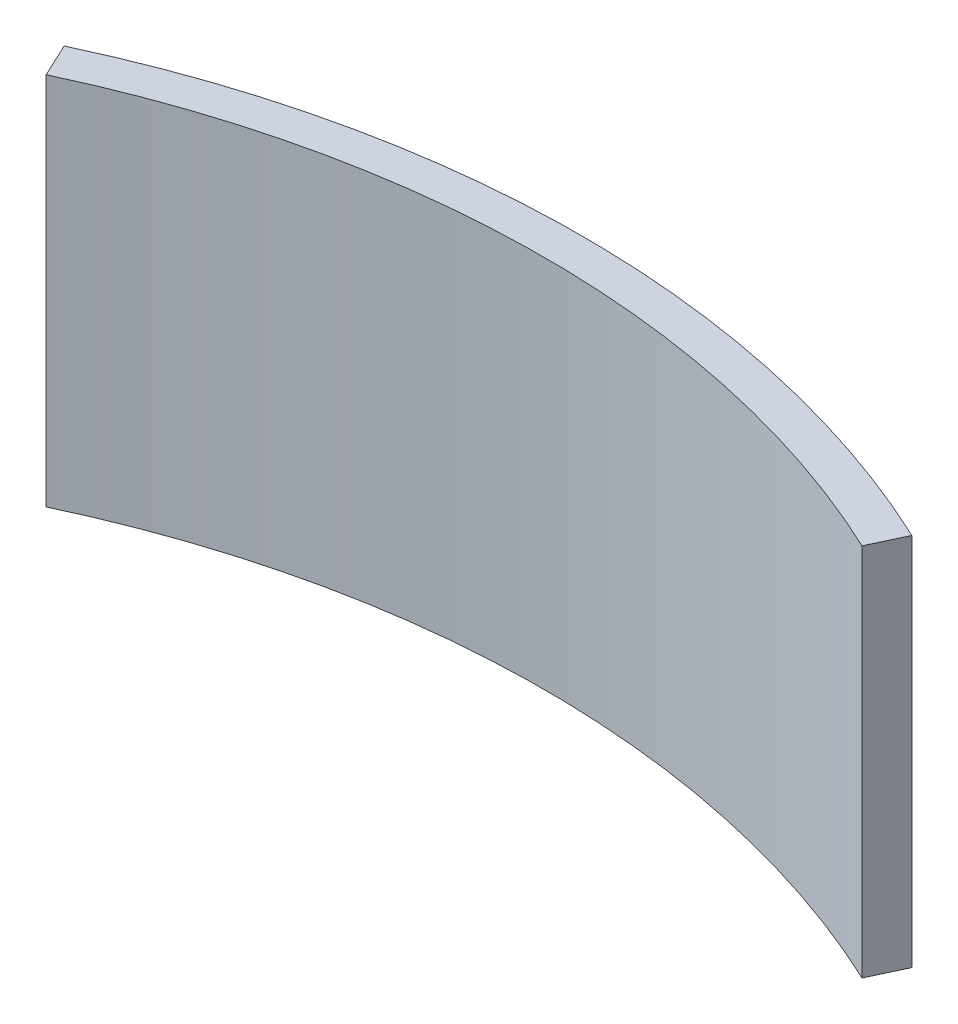
ISO-10303-21;
HEADER;
FILE_DESCRIPTION(('STEP AP214'),'2;1');
FILE_NAME('part.step','',(''),(''),'','','');
FILE_SCHEMA(('AUTOMOTIVE_DESIGN { 1 0 10303 214 1 1 1 1 }'));
ENDSEC;
DATA;
#1=APPLICATION_CONTEXT('core data for automotive mechanical design processes');
#2=APPLICATION_PROTOCOL_DEFINITION('international standard','automotive_design',2000,#1);
#3=PRODUCT_CONTEXT('',#1,'mechanical');
#4=PRODUCT('Part','Part','',(#3));
#5=PRODUCT_RELATED_PRODUCT_CATEGORY('part','',(#4));
#6=PRODUCT_DEFINITION_FORMATION('','',#4);
#7=PRODUCT_DEFINITION_CONTEXT('part definition',#1,'design');
#8=PRODUCT_DEFINITION('design','',#6,#7);
#9=PRODUCT_DEFINITION_SHAPE('','',#8);
#10=(LENGTH_UNIT() NAMED_UNIT(*) SI_UNIT(.MILLI.,.METRE.));
#11=(NAMED_UNIT(*) PLANE_ANGLE_UNIT() SI_UNIT($,.RADIAN.));
#12=(NAMED_UNIT(*) SI_UNIT($,.STERADIAN.) SOLID_ANGLE_UNIT());
#13=UNCERTAINTY_MEASURE_WITH_UNIT(LENGTH_MEASURE(1.E-05),#10,'distance_accuracy_value','');
#14=(GEOMETRIC_REPRESENTATION_CONTEXT(3) GLOBAL_UNCERTAINTY_ASSIGNED_CONTEXT((#13)) GLOBAL_UNIT_ASSIGNED_CONTEXT((#10,
#11,#12)) REPRESENTATION_CONTEXT('',''));
#15=CARTESIAN_POINT('',(0.,0.,0.));
#16=DIRECTION('',(0.,0.,1.));
#17=DIRECTION('',(1.,0.,0.));
#18=AXIS2_PLACEMENT_3D('',#15,#16,#17);
#19=CARTESIAN_POINT('',(0.,30.,0.));
#20=DIRECTION('',(0.,-1.,0.));
#21=DIRECTION('',(0.,0.,-1.));
#22=AXIS2_PLACEMENT_3D('',#19,#20,#21);
#23=CYLINDRICAL_SURFACE('',#22,80.);
#24=CARTESIAN_POINT('',(0.,0.,0.));
#25=DIRECTION('',(0.,1.,0.));
#26=DIRECTION('',(0.,0.,1.));
#27=AXIS2_PLACEMENT_3D('',#24,#25,#26);
#28=CIRCLE('',#27,80.);
#29=CARTESIAN_POINT('',(33.9742323512018,0.,-72.427560611597));
#30=VERTEX_POINT('',#29);
#31=CARTESIAN_POINT('',(-33.9742323512018,0.,-72.427560611597));
#32=VERTEX_POINT('',#31);
#33=EDGE_CURVE('E96',#30,#32,#28,.T.);
#34=ORIENTED_EDGE('',*,*,#33,.T.);
#35=DIRECTION('',(0.,-1.,0.));
#36=VECTOR('',#35,1.);
#37=CARTESIAN_POINT('',(-33.9742323512018,30.,-72.427560611597));
#38=LINE('',#37,#36);
#39=CARTESIAN_POINT('',(-33.9742323512018,30.,-72.427560611597));
#40=VERTEX_POINT('',#39);
#41=EDGE_CURVE('E11',#40,#32,#38,.T.);
#42=ORIENTED_EDGE('',*,*,#41,.F.);
#43=CARTESIAN_POINT('',(0.,30.,0.));
#44=DIRECTION('',(0.,1.,0.));
#45=DIRECTION('',(0.,0.,1.));
#46=AXIS2_PLACEMENT_3D('',#43,#44,#45);
#47=CIRCLE('',#46,80.);
#48=CARTESIAN_POINT('',(33.9742323512018,30.,-72.427560611597));
#49=VERTEX_POINT('',#48);
#50=EDGE_CURVE('E84',#49,#40,#47,.T.);
#51=ORIENTED_EDGE('',*,*,#50,.F.);
#52=DIRECTION('',(0.,-1.,0.));
#53=VECTOR('',#52,1.);
#54=CARTESIAN_POINT('',(33.9742323512018,30.,-72.427560611597));
#55=LINE('',#54,#53);
#56=EDGE_CURVE('E92',#49,#30,#55,.T.);
#57=ORIENTED_EDGE('',*,*,#56,.T.);
#58=EDGE_LOOP('',(#34,#42,#51,#57));
#59=FACE_BOUND('',#58,.T.);
#60=ADVANCED_FACE('F33',(#59),#23,.T.);
#61=CARTESIAN_POINT('',(-33.9742323512018,30.,-72.427560611597));
#62=DIRECTION('',(0.905344507644962,0.,-0.424677904390022));
#63=DIRECTION('',(-0.424677904390022,0.,-0.905344507644962));
#64=AXIS2_PLACEMENT_3D('',#61,#62,#63);
#65=PLANE('',#64);
#66=DIRECTION('',(0.424677904390022,0.,0.905344507644962));
#67=VECTOR('',#66,1.);
#68=CARTESIAN_POINT('',(-33.9742323512018,0.,-72.427560611597));
#69=LINE('',#68,#67);
#70=CARTESIAN_POINT('',(-32.7001986380317,0.,-69.7115270886621));
#71=VERTEX_POINT('',#70);
#72=EDGE_CURVE('E88',#32,#71,#69,.T.);
#73=ORIENTED_EDGE('',*,*,#72,.T.);
#74=DIRECTION('',(0.,-1.,0.));
#75=VECTOR('',#74,1.);
#76=CARTESIAN_POINT('',(-32.7001986380317,30.,-69.7115270886621));
#77=LINE('',#76,#75);
#78=CARTESIAN_POINT('',(-32.7001986380317,30.,-69.7115270886621));
#79=VERTEX_POINT('',#78);
#80=EDGE_CURVE('E41',#79,#71,#77,.T.);
#81=ORIENTED_EDGE('',*,*,#80,.F.);
#82=DIRECTION('',(0.424677904390022,0.,0.905344507644962));
#83=VECTOR('',#82,1.);
#84=CARTESIAN_POINT('',(-33.9742323512018,30.,-72.427560611597));
#85=LINE('',#84,#83);
#86=EDGE_CURVE('E79',#40,#79,#85,.T.);
#87=ORIENTED_EDGE('',*,*,#86,.F.);
#88=ORIENTED_EDGE('',*,*,#41,.T.);
#89=EDGE_LOOP('',(#73,#81,#87,#88));
#90=FACE_BOUND('',#89,.T.);
#91=ADVANCED_FACE('F87',(#90),#65,.F.);
#92=CARTESIAN_POINT('',(0.,30.,0.));
#93=DIRECTION('',(0.,-1.,0.));
#94=DIRECTION('',(0.,0.,-1.));
#95=AXIS2_PLACEMENT_3D('',#92,#93,#94);
#96=CYLINDRICAL_SURFACE('',#95,77.);
#97=CARTESIAN_POINT('',(0.,0.,0.));
#98=DIRECTION('',(0.,-1.,0.));
#99=DIRECTION('',(0.,0.,1.));
#100=AXIS2_PLACEMENT_3D('',#97,#98,#99);
#101=CIRCLE('',#100,77.);
#102=CARTESIAN_POINT('',(32.7001986380317,0.,-69.7115270886621));
#103=VERTEX_POINT('',#102);
#104=EDGE_CURVE('E66',#71,#103,#101,.T.);
#105=ORIENTED_EDGE('',*,*,#104,.T.);
#106=DIRECTION('',(0.,-1.,0.));
#107=VECTOR('',#106,1.);
#108=CARTESIAN_POINT('',(32.7001986380317,30.,-69.7115270886621));
#109=LINE('',#108,#107);
#110=CARTESIAN_POINT('',(32.7001986380317,30.,-69.7115270886621));
#111=VERTEX_POINT('',#110);
#112=EDGE_CURVE('E89',#111,#103,#109,.T.);
#113=ORIENTED_EDGE('',*,*,#112,.F.);
#114=CARTESIAN_POINT('',(0.,30.,0.));
#115=DIRECTION('',(0.,-1.,0.));
#116=DIRECTION('',(0.,0.,1.));
#117=AXIS2_PLACEMENT_3D('',#114,#115,#116);
#118=CIRCLE('',#117,77.);
#119=EDGE_CURVE('E82',#79,#111,#118,.T.);
#120=ORIENTED_EDGE('',*,*,#119,.F.);
#121=ORIENTED_EDGE('',*,*,#80,.T.);
#122=EDGE_LOOP('',(#105,#113,#120,#121));
#123=FACE_BOUND('',#122,.T.);
#124=ADVANCED_FACE('F90',(#123),#96,.F.);
#125=CARTESIAN_POINT('',(33.9742323512018,30.,-72.427560611597));
#126=DIRECTION('',(-0.905344507644962,0.,-0.424677904390022));
#127=DIRECTION('',(-0.424677904390023,0.,0.905344507644962));
#128=AXIS2_PLACEMENT_3D('',#125,#126,#127);
#129=PLANE('',#128);
#130=DIRECTION('',(0.424677904390022,0.,-0.905344507644962));
#131=VECTOR('',#130,1.);
#132=CARTESIAN_POINT('',(33.9742323512018,0.,-72.427560611597));
#133=LINE('',#132,#131);
#134=EDGE_CURVE('E72',#103,#30,#133,.T.);
#135=ORIENTED_EDGE('',*,*,#134,.T.);
#136=ORIENTED_EDGE('',*,*,#56,.F.);
#137=DIRECTION('',(0.424677904390022,0.,-0.905344507644962));
#138=VECTOR('',#137,1.);
#139=CARTESIAN_POINT('',(33.9742323512018,30.,-72.427560611597));
#140=LINE('',#139,#138);
#141=EDGE_CURVE('E49',#111,#49,#140,.T.);
#142=ORIENTED_EDGE('',*,*,#141,.F.);
#143=ORIENTED_EDGE('',*,*,#112,.T.);
#144=EDGE_LOOP('',(#135,#136,#142,#143));
#145=FACE_BOUND('',#144,.T.);
#146=ADVANCED_FACE('F103',(#145),#129,.F.);
#147=CARTESIAN_POINT('',(0.,30.,0.));
#148=DIRECTION('',(0.,1.,0.));
#149=DIRECTION('',(0.,0.,1.));
#150=AXIS2_PLACEMENT_3D('',#147,#148,#149);
#151=PLANE('',#150);
#152=ORIENTED_EDGE('',*,*,#50,.T.);
#153=ORIENTED_EDGE('',*,*,#86,.T.);
#154=ORIENTED_EDGE('',*,*,#119,.T.);
#155=ORIENTED_EDGE('',*,*,#141,.T.);
#156=EDGE_LOOP('',(#152,#153,#154,#155));
#157=FACE_BOUND('',#156,.T.);
#158=ADVANCED_FACE('F80',(#157),#151,.T.);
#159=CARTESIAN_POINT('',(0.,0.,0.));
#160=DIRECTION('',(0.,1.,0.));
#161=DIRECTION('',(0.,0.,1.));
#162=AXIS2_PLACEMENT_3D('',#159,#160,#161);
#163=PLANE('',#162);
#164=ORIENTED_EDGE('',*,*,#33,.F.);
#165=ORIENTED_EDGE('',*,*,#134,.F.);
#166=ORIENTED_EDGE('',*,*,#104,.F.);
#167=ORIENTED_EDGE('',*,*,#72,.F.);
#168=EDGE_LOOP('',(#164,#165,#166,#167));
#169=FACE_BOUND('',#168,.T.);
#170=ADVANCED_FACE('F106',(#169),#163,.F.);
#171=CLOSED_SHELL('',(#60,#91,#124,#146,#158,#170));
#172=MANIFOLD_SOLID_BREP('B2',#171);
#173=ADVANCED_BREP_SHAPE_REPRESENTATION('',(#18,#172),#14);
#174=SHAPE_DEFINITION_REPRESENTATION(#9,#173);
ENDSEC;
END-ISO-10303-21;
